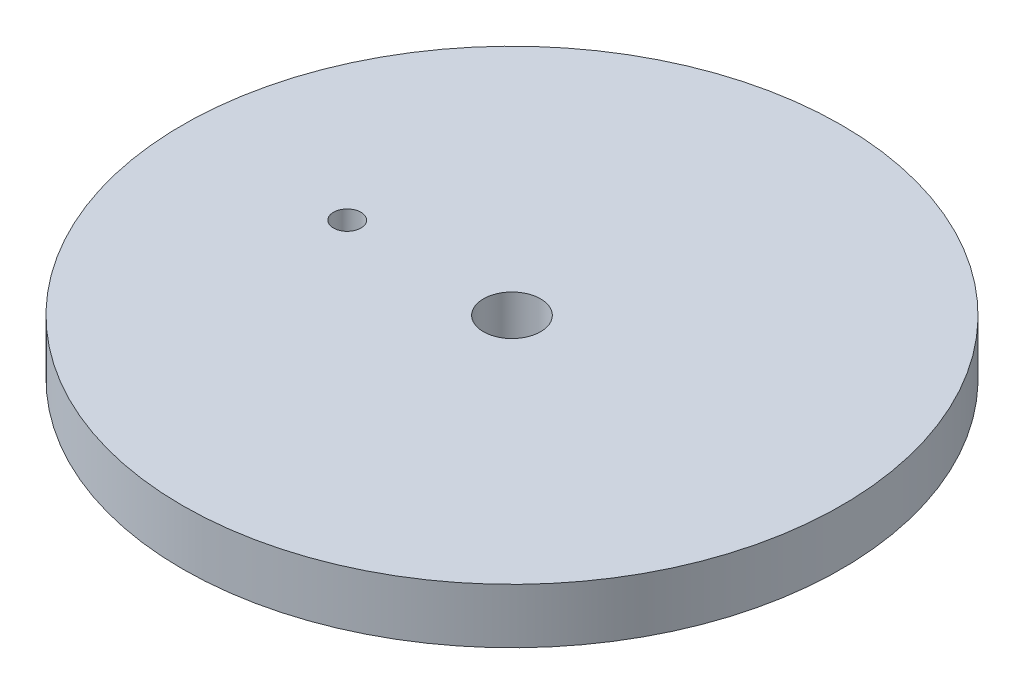
ISO-10303-21;
HEADER;
FILE_DESCRIPTION(('STEP AP214'),'2;1');
FILE_NAME('part.step','',(''),(''),'','','');
FILE_SCHEMA(('AUTOMOTIVE_DESIGN { 1 0 10303 214 1 1 1 1 }'));
ENDSEC;
DATA;
#1=APPLICATION_CONTEXT('core data for automotive mechanical design processes');
#2=APPLICATION_PROTOCOL_DEFINITION('international standard','automotive_design',2000,#1);
#3=PRODUCT_CONTEXT('',#1,'mechanical');
#4=PRODUCT('Part','Part','',(#3));
#5=PRODUCT_RELATED_PRODUCT_CATEGORY('part','',(#4));
#6=PRODUCT_DEFINITION_FORMATION('','',#4);
#7=PRODUCT_DEFINITION_CONTEXT('part definition',#1,'design');
#8=PRODUCT_DEFINITION('design','',#6,#7);
#9=PRODUCT_DEFINITION_SHAPE('','',#8);
#10=(LENGTH_UNIT() NAMED_UNIT(*) SI_UNIT(.MILLI.,.METRE.));
#11=(NAMED_UNIT(*) PLANE_ANGLE_UNIT() SI_UNIT($,.RADIAN.));
#12=(NAMED_UNIT(*) SI_UNIT($,.STERADIAN.) SOLID_ANGLE_UNIT());
#13=UNCERTAINTY_MEASURE_WITH_UNIT(LENGTH_MEASURE(1.E-05),#10,'distance_accuracy_value','');
#14=(GEOMETRIC_REPRESENTATION_CONTEXT(3) GLOBAL_UNCERTAINTY_ASSIGNED_CONTEXT((#13)) GLOBAL_UNIT_ASSIGNED_CONTEXT((#10,
#11,#12)) REPRESENTATION_CONTEXT('',''));
#15=CARTESIAN_POINT('',(0.,0.,0.));
#16=DIRECTION('',(0.,0.,1.));
#17=DIRECTION('',(1.,0.,0.));
#18=AXIS2_PLACEMENT_3D('',#15,#16,#17);
#19=CARTESIAN_POINT('',(0.,6.35,0.));
#20=DIRECTION('',(0.,1.,0.));
#21=DIRECTION('',(0.,0.,1.));
#22=AXIS2_PLACEMENT_3D('',#19,#20,#21);
#23=PLANE('',#22);
#24=CARTESIAN_POINT('',(0.,6.35,0.));
#25=DIRECTION('',(0.,1.,0.));
#26=DIRECTION('',(0.,0.,1.));
#27=AXIS2_PLACEMENT_3D('',#24,#25,#26);
#28=CIRCLE('',#27,3.302);
#29=CARTESIAN_POINT('',(0.,6.35,3.302));
#30=VERTEX_POINT('',#29);
#31=EDGE_CURVE('E45',#30,#30,#28,.T.);
#32=ORIENTED_EDGE('',*,*,#31,.F.);
#33=EDGE_LOOP('',(#32));
#34=FACE_BOUND('',#33,.T.);
#35=CARTESIAN_POINT('',(0.,6.35,0.));
#36=DIRECTION('',(0.,1.,0.));
#37=DIRECTION('',(0.,0.,1.));
#38=AXIS2_PLACEMENT_3D('',#35,#36,#37);
#39=CIRCLE('',#38,38.1);
#40=CARTESIAN_POINT('',(0.,6.35,38.1));
#41=VERTEX_POINT('',#40);
#42=EDGE_CURVE('E10',#41,#41,#39,.T.);
#43=ORIENTED_EDGE('',*,*,#42,.T.);
#44=EDGE_LOOP('',(#43));
#45=FACE_BOUND('',#44,.T.);
#46=CARTESIAN_POINT('',(-19.05,6.35,0.));
#47=DIRECTION('',(0.,1.,0.));
#48=DIRECTION('',(0.,0.,1.));
#49=AXIS2_PLACEMENT_3D('',#46,#47,#48);
#50=CIRCLE('',#49,1.5875);
#51=CARTESIAN_POINT('',(-19.05,6.35,1.5875));
#52=VERTEX_POINT('',#51);
#53=EDGE_CURVE('E50',#52,#52,#50,.T.);
#54=ORIENTED_EDGE('',*,*,#53,.F.);
#55=EDGE_LOOP('',(#54));
#56=FACE_BOUND('',#55,.T.);
#57=ADVANCED_FACE('F34',(#34,#45,#56),#23,.T.);
#58=CARTESIAN_POINT('',(0.,0.,0.));
#59=DIRECTION('',(0.,1.,0.));
#60=DIRECTION('',(0.,0.,1.));
#61=AXIS2_PLACEMENT_3D('',#58,#59,#60);
#62=PLANE('',#61);
#63=CARTESIAN_POINT('',(0.,0.,0.));
#64=DIRECTION('',(0.,1.,0.));
#65=DIRECTION('',(0.,0.,1.));
#66=AXIS2_PLACEMENT_3D('',#63,#64,#65);
#67=CIRCLE('',#66,38.1);
#68=CARTESIAN_POINT('',(0.,0.,38.1));
#69=VERTEX_POINT('',#68);
#70=EDGE_CURVE('E38',#69,#69,#67,.T.);
#71=ORIENTED_EDGE('',*,*,#70,.F.);
#72=EDGE_LOOP('',(#71));
#73=FACE_BOUND('',#72,.T.);
#74=CARTESIAN_POINT('',(0.,0.,0.));
#75=DIRECTION('',(0.,1.,0.));
#76=DIRECTION('',(0.,0.,1.));
#77=AXIS2_PLACEMENT_3D('',#74,#75,#76);
#78=CIRCLE('',#77,3.302);
#79=CARTESIAN_POINT('',(0.,0.,3.302));
#80=VERTEX_POINT('',#79);
#81=EDGE_CURVE('E47',#80,#80,#78,.T.);
#82=ORIENTED_EDGE('',*,*,#81,.T.);
#83=EDGE_LOOP('',(#82));
#84=FACE_BOUND('',#83,.T.);
#85=CARTESIAN_POINT('',(-19.05,0.,0.));
#86=DIRECTION('',(0.,1.,0.));
#87=DIRECTION('',(0.,0.,1.));
#88=AXIS2_PLACEMENT_3D('',#85,#86,#87);
#89=CIRCLE('',#88,1.5875);
#90=CARTESIAN_POINT('',(-19.05,0.,1.5875));
#91=VERTEX_POINT('',#90);
#92=EDGE_CURVE('E53',#91,#91,#89,.T.);
#93=ORIENTED_EDGE('',*,*,#92,.T.);
#94=EDGE_LOOP('',(#93));
#95=FACE_BOUND('',#94,.T.);
#96=ADVANCED_FACE('F63',(#73,#84,#95),#62,.F.);
#97=CARTESIAN_POINT('',(0.,6.35,0.));
#98=DIRECTION('',(0.,-1.,0.));
#99=DIRECTION('',(0.,0.,-1.));
#100=AXIS2_PLACEMENT_3D('',#97,#98,#99);
#101=CYLINDRICAL_SURFACE('',#100,38.1);
#102=ORIENTED_EDGE('',*,*,#42,.F.);
#103=EDGE_LOOP('',(#102));
#104=FACE_BOUND('',#103,.T.);
#105=ORIENTED_EDGE('',*,*,#70,.T.);
#106=EDGE_LOOP('',(#105));
#107=FACE_BOUND('',#106,.T.);
#108=ADVANCED_FACE('F36',(#104,#107),#101,.T.);
#109=CARTESIAN_POINT('',(0.,6.35,0.));
#110=DIRECTION('',(0.,-1.,0.));
#111=DIRECTION('',(0.,0.,-1.));
#112=AXIS2_PLACEMENT_3D('',#109,#110,#111);
#113=CYLINDRICAL_SURFACE('',#112,3.302);
#114=ORIENTED_EDGE('',*,*,#31,.T.);
#115=EDGE_LOOP('',(#114));
#116=FACE_BOUND('',#115,.T.);
#117=ORIENTED_EDGE('',*,*,#81,.F.);
#118=EDGE_LOOP('',(#117));
#119=FACE_BOUND('',#118,.T.);
#120=ADVANCED_FACE('F72',(#116,#119),#113,.F.);
#121=CARTESIAN_POINT('',(-19.05,6.35,0.));
#122=DIRECTION('',(0.,-1.,0.));
#123=DIRECTION('',(0.,0.,-1.));
#124=AXIS2_PLACEMENT_3D('',#121,#122,#123);
#125=CYLINDRICAL_SURFACE('',#124,1.5875);
#126=ORIENTED_EDGE('',*,*,#53,.T.);
#127=EDGE_LOOP('',(#126));
#128=FACE_BOUND('',#127,.T.);
#129=ORIENTED_EDGE('',*,*,#92,.F.);
#130=EDGE_LOOP('',(#129));
#131=FACE_BOUND('',#130,.T.);
#132=ADVANCED_FACE('F59',(#128,#131),#125,.F.);
#133=CLOSED_SHELL('',(#57,#96,#108,#120,#132));
#134=MANIFOLD_SOLID_BREP('B2',#133);
#135=ADVANCED_BREP_SHAPE_REPRESENTATION('',(#18,#134),#14);
#136=SHAPE_DEFINITION_REPRESENTATION(#9,#135);
ENDSEC;
END-ISO-10303-21;
